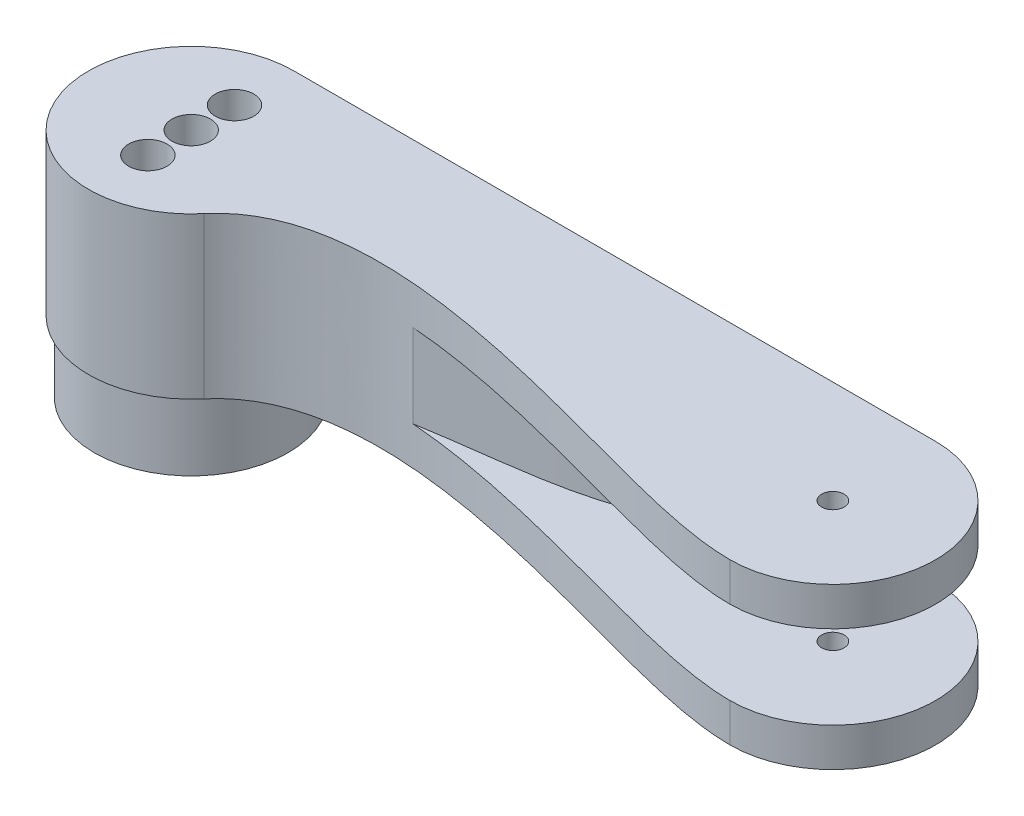
ISO-10303-21;
HEADER;
FILE_DESCRIPTION(('STEP AP214'),'2;1');
FILE_NAME('part.step','',(''),(''),'','','');
FILE_SCHEMA(('AUTOMOTIVE_DESIGN { 1 0 10303 214 1 1 1 1 }'));
ENDSEC;
DATA;
#1=APPLICATION_CONTEXT('core data for automotive mechanical design processes');
#2=APPLICATION_PROTOCOL_DEFINITION('international standard','automotive_design',2000,#1);
#3=PRODUCT_CONTEXT('',#1,'mechanical');
#4=PRODUCT('Part','Part','',(#3));
#5=PRODUCT_RELATED_PRODUCT_CATEGORY('part','',(#4));
#6=PRODUCT_DEFINITION_FORMATION('','',#4);
#7=PRODUCT_DEFINITION_CONTEXT('part definition',#1,'design');
#8=PRODUCT_DEFINITION('design','',#6,#7);
#9=PRODUCT_DEFINITION_SHAPE('','',#8);
#10=(LENGTH_UNIT() NAMED_UNIT(*) SI_UNIT(.MILLI.,.METRE.));
#11=(NAMED_UNIT(*) PLANE_ANGLE_UNIT() SI_UNIT($,.RADIAN.));
#12=(NAMED_UNIT(*) SI_UNIT($,.STERADIAN.) SOLID_ANGLE_UNIT());
#13=UNCERTAINTY_MEASURE_WITH_UNIT(LENGTH_MEASURE(1.E-05),#10,'distance_accuracy_value','');
#14=(GEOMETRIC_REPRESENTATION_CONTEXT(3) GLOBAL_UNCERTAINTY_ASSIGNED_CONTEXT((#13)) GLOBAL_UNIT_ASSIGNED_CONTEXT((#10,
#11,#12)) REPRESENTATION_CONTEXT('',''));
#15=CARTESIAN_POINT('',(0.,0.,0.));
#16=DIRECTION('',(0.,0.,1.));
#17=DIRECTION('',(1.,0.,0.));
#18=AXIS2_PLACEMENT_3D('',#15,#16,#17);
#19=CARTESIAN_POINT('',(-50.,6.,0.));
#20=DIRECTION('',(0.,1.,0.));
#21=DIRECTION('',(0.,0.,1.));
#22=AXIS2_PLACEMENT_3D('',#19,#20,#21);
#23=PLANE('',#22);
#24=CARTESIAN_POINT('',(50.,6.,0.));
#25=DIRECTION('',(0.,-1.,0.));
#26=DIRECTION('',(0.,0.,-1.));
#27=AXIS2_PLACEMENT_3D('',#24,#25,#26);
#28=CIRCLE('',#27,1.75);
#29=CARTESIAN_POINT('',(50.,6.,-1.75000000000002));
#30=VERTEX_POINT('',#29);
#31=EDGE_CURVE('E146',#30,#30,#28,.T.);
#32=ORIENTED_EDGE('',*,*,#31,.T.);
#33=EDGE_LOOP('',(#32));
#34=FACE_BOUND('',#33,.T.);
#35=CARTESIAN_POINT('',(-34.2856764118283,6.,16.));
#36=CARTESIAN_POINT('',(-23.6762783257379,6.,-6.11814593544332));
#37=CARTESIAN_POINT('',(21.9928600173767,6.,10.8621580125102));
#38=CARTESIAN_POINT('',(30.,6.,-16.));
#39=B_SPLINE_CURVE_WITH_KNOTS('',3,(#35,#36,#37,#38),.UNSPECIFIED.,.F.,.F.,(4,4),(0.,1.),.UNSPECIFIED.);
#40=CARTESIAN_POINT('',(-12.0743102711399,6.00000000000001,3.35363574440017));
#41=VERTEX_POINT('',#40);
#42=CARTESIAN_POINT('',(30.,6.,-16.));
#43=VERTEX_POINT('',#42);
#44=EDGE_CURVE('E88',#41,#43,#39,.T.);
#45=ORIENTED_EDGE('',*,*,#44,.F.);
#46=CARTESIAN_POINT('',(-37.7312638091283,6.,10.2702537592211));
#47=CARTESIAN_POINT('',(-30.3325567034885,6.,1.43183673850022));
#48=CARTESIAN_POINT('',(6.05040288848306,6.,3.36458797267431));
#49=CARTESIAN_POINT('',(38.5122315829498,6.,16.));
#50=CARTESIAN_POINT('',(50.,6.,16.));
#51=B_SPLINE_CURVE_WITH_KNOTS('',3,(#46,#47,#48,#49,#50),.UNSPECIFIED.,.F.,.F.,(4,1,4),(0.,
0.426660682996785,1.),.UNSPECIFIED.);
#52=CARTESIAN_POINT('',(50.,6.,16.));
#53=VERTEX_POINT('',#52);
#54=EDGE_CURVE('E240',#53,#41,#51,.F.);
#55=ORIENTED_EDGE('',*,*,#54,.F.);
#56=CARTESIAN_POINT('',(50.,6.,0.));
#57=DIRECTION('',(0.,1.,0.));
#58=DIRECTION('',(0.,0.,1.));
#59=AXIS2_PLACEMENT_3D('',#56,#57,#58);
#60=CIRCLE('',#59,16.);
#61=CARTESIAN_POINT('',(50.,6.,-16.));
#62=VERTEX_POINT('',#61);
#63=EDGE_CURVE('E68',#53,#62,#60,.T.);
#64=ORIENTED_EDGE('',*,*,#63,.T.);
#65=DIRECTION('',(-1.,0.,0.));
#66=VECTOR('',#65,1.);
#67=CARTESIAN_POINT('',(-50.,6.,-16.));
#68=LINE('',#67,#66);
#69=EDGE_CURVE('E153',#62,#43,#68,.T.);
#70=ORIENTED_EDGE('',*,*,#69,.T.);
#71=EDGE_LOOP('',(#45,#55,#64,#70));
#72=FACE_BOUND('',#71,.T.);
#73=ADVANCED_FACE('F43',(#34,#72),#23,.T.);
#74=CARTESIAN_POINT('',(-50.,0.,0.));
#75=DIRECTION('',(0.,1.,0.));
#76=DIRECTION('',(0.,0.,1.));
#77=AXIS2_PLACEMENT_3D('',#74,#75,#76);
#78=PLANE('',#77);
#79=CARTESIAN_POINT('',(-50.,0.,0.));
#80=DIRECTION('',(0.,1.,0.));
#81=DIRECTION('',(0.,0.,1.));
#82=AXIS2_PLACEMENT_3D('',#79,#80,#81);
#83=CIRCLE('',#82,15.1);
#84=CARTESIAN_POINT('',(-50.,0.,15.1));
#85=VERTEX_POINT('',#84);
#86=EDGE_CURVE('E11',#85,#85,#83,.F.);
#87=ORIENTED_EDGE('',*,*,#86,.F.);
#88=EDGE_LOOP('',(#87));
#89=FACE_BOUND('',#88,.T.);
#90=CARTESIAN_POINT('',(50.,0.,0.));
#91=DIRECTION('',(0.,-1.,0.));
#92=DIRECTION('',(0.,0.,-1.));
#93=AXIS2_PLACEMENT_3D('',#90,#91,#92);
#94=CIRCLE('',#93,1.75);
#95=CARTESIAN_POINT('',(50.,0.,-1.75000000000002));
#96=VERTEX_POINT('',#95);
#97=EDGE_CURVE('E469',#96,#96,#94,.T.);
#98=ORIENTED_EDGE('',*,*,#97,.F.);
#99=EDGE_LOOP('',(#98));
#100=FACE_BOUND('',#99,.T.);
#101=CARTESIAN_POINT('',(-37.7312638091283,0.,10.2702537592211));
#102=CARTESIAN_POINT('',(-30.3325567034885,0.,1.43183673850022));
#103=CARTESIAN_POINT('',(6.05040288848306,0.,3.36458797267431));
#104=CARTESIAN_POINT('',(38.5122315829498,0.,16.));
#105=CARTESIAN_POINT('',(50.,0.,16.));
#106=B_SPLINE_CURVE_WITH_KNOTS('',3,(#101,#102,#103,#104,#105),.UNSPECIFIED.,.F.,.F.,(4,1,4),
(0.,0.426660682996785,1.),.UNSPECIFIED.);
#107=CARTESIAN_POINT('',(50.,0.,16.));
#108=VERTEX_POINT('',#107);
#109=CARTESIAN_POINT('',(-37.7312638091283,0.,10.2702537592211));
#110=VERTEX_POINT('',#109);
#111=EDGE_CURVE('E128',#108,#110,#106,.F.);
#112=ORIENTED_EDGE('',*,*,#111,.T.);
#113=CARTESIAN_POINT('',(-50.,0.,0.));
#114=DIRECTION('',(0.,1.,0.));
#115=DIRECTION('',(0.,0.,1.));
#116=AXIS2_PLACEMENT_3D('',#113,#114,#115);
#117=CIRCLE('',#116,16.);
#118=CARTESIAN_POINT('',(-50.,0.,-16.));
#119=VERTEX_POINT('',#118);
#120=EDGE_CURVE('E143',#119,#110,#117,.T.);
#121=ORIENTED_EDGE('',*,*,#120,.F.);
#122=DIRECTION('',(-1.,0.,0.));
#123=VECTOR('',#122,1.);
#124=CARTESIAN_POINT('',(-50.,0.,-16.));
#125=LINE('',#124,#123);
#126=CARTESIAN_POINT('',(50.,0.,-16.));
#127=VERTEX_POINT('',#126);
#128=EDGE_CURVE('E142',#127,#119,#125,.T.);
#129=ORIENTED_EDGE('',*,*,#128,.F.);
#130=CARTESIAN_POINT('',(50.,0.,0.));
#131=DIRECTION('',(0.,1.,0.));
#132=DIRECTION('',(0.,0.,1.));
#133=AXIS2_PLACEMENT_3D('',#130,#131,#132);
#134=CIRCLE('',#133,16.);
#135=EDGE_CURVE('E80',#108,#127,#134,.T.);
#136=ORIENTED_EDGE('',*,*,#135,.F.);
#137=EDGE_LOOP('',(#112,#121,#129,#136));
#138=FACE_BOUND('',#137,.T.);
#139=ADVANCED_FACE('F141',(#89,#100,#138),#78,.F.);
#140=CARTESIAN_POINT('',(-34.2856764118283,19.,16.));
#141=CARTESIAN_POINT('',(-23.6762783257379,19.,-6.11814593544332));
#142=CARTESIAN_POINT('',(21.9928600173767,19.,10.8621580125102));
#143=CARTESIAN_POINT('',(30.,19.,-16.));
#144=B_SPLINE_CURVE_WITH_KNOTS('',3,(#140,#141,#142,#143),.UNSPECIFIED.,.F.,.F.,(4,4),(0.,1.),.UNSPECIFIED.);
#145=DIRECTION('',(0.,-1.,0.));
#146=VECTOR('',#145,1.);
#147=SURFACE_OF_LINEAR_EXTRUSION('',#144,#146);
#148=DIRECTION('',(0.,-1.,0.));
#149=VECTOR('',#148,1.);
#150=CARTESIAN_POINT('',(-12.0743102711399,19.,3.35363574440017));
#151=LINE('',#150,#149);
#152=CARTESIAN_POINT('',(-12.074310274312,19.,3.35363574415139));
#153=VERTEX_POINT('',#152);
#154=EDGE_CURVE('E246',#153,#41,#151,.T.);
#155=ORIENTED_EDGE('',*,*,#154,.T.);
#156=ORIENTED_EDGE('',*,*,#44,.T.);
#157=DIRECTION('',(0.,-1.,0.));
#158=VECTOR('',#157,1.);
#159=CARTESIAN_POINT('',(30.,19.,-16.));
#160=LINE('',#159,#158);
#161=CARTESIAN_POINT('',(30.,19.,-16.));
#162=VERTEX_POINT('',#161);
#163=EDGE_CURVE('E157',#162,#43,#160,.T.);
#164=ORIENTED_EDGE('',*,*,#163,.F.);
#165=EDGE_CURVE('E95',#153,#162,#144,.T.);
#166=ORIENTED_EDGE('',*,*,#165,.F.);
#167=EDGE_LOOP('',(#155,#156,#164,#166));
#168=FACE_BOUND('',#167,.T.);
#169=ADVANCED_FACE('F175',(#168),#147,.F.);
#170=CARTESIAN_POINT('',(-50.,19.,0.));
#171=DIRECTION('',(0.,1.,0.));
#172=DIRECTION('',(0.,0.,1.));
#173=AXIS2_PLACEMENT_3D('',#170,#171,#172);
#174=PLANE('',#173);
#175=CARTESIAN_POINT('',(50.,19.,0.));
#176=DIRECTION('',(0.,1.,0.));
#177=DIRECTION('',(0.,0.,1.));
#178=AXIS2_PLACEMENT_3D('',#175,#176,#177);
#179=CIRCLE('',#178,1.75);
#180=CARTESIAN_POINT('',(50.,19.,1.74999999999999));
#181=VERTEX_POINT('',#180);
#182=EDGE_CURVE('E222',#181,#181,#179,.F.);
#183=ORIENTED_EDGE('',*,*,#182,.F.);
#184=EDGE_LOOP('',(#183));
#185=FACE_BOUND('',#184,.T.);
#186=CARTESIAN_POINT('',(-37.7312638091283,19.,10.2702537592211));
#187=CARTESIAN_POINT('',(-30.3325567034885,19.,1.43183673850022));
#188=CARTESIAN_POINT('',(6.05040288848306,19.,3.36458797267431));
#189=CARTESIAN_POINT('',(38.5122315829498,19.,16.));
#190=CARTESIAN_POINT('',(50.,19.,16.));
#191=B_SPLINE_CURVE_WITH_KNOTS('',3,(#186,#187,#188,#189,#190),.UNSPECIFIED.,.F.,.F.,(4,1,4),
(0.,0.426660682996785,1.),.UNSPECIFIED.);
#192=CARTESIAN_POINT('',(50.,19.,16.));
#193=VERTEX_POINT('',#192);
#194=EDGE_CURVE('E134',#193,#153,#191,.F.);
#195=ORIENTED_EDGE('',*,*,#194,.T.);
#196=ORIENTED_EDGE('',*,*,#165,.T.);
#197=DIRECTION('',(-1.,0.,0.));
#198=VECTOR('',#197,1.);
#199=CARTESIAN_POINT('',(-50.,19.,-16.));
#200=LINE('',#199,#198);
#201=CARTESIAN_POINT('',(50.,19.,-16.));
#202=VERTEX_POINT('',#201);
#203=EDGE_CURVE('E218',#202,#162,#200,.T.);
#204=ORIENTED_EDGE('',*,*,#203,.F.);
#205=CARTESIAN_POINT('',(50.,19.,0.));
#206=DIRECTION('',(0.,1.,0.));
#207=DIRECTION('',(0.,0.,1.));
#208=AXIS2_PLACEMENT_3D('',#205,#206,#207);
#209=CIRCLE('',#208,16.);
#210=EDGE_CURVE('E220',#193,#202,#209,.T.);
#211=ORIENTED_EDGE('',*,*,#210,.F.);
#212=EDGE_LOOP('',(#195,#196,#204,#211));
#213=FACE_BOUND('',#212,.T.);
#214=ADVANCED_FACE('F179',(#185,#213),#174,.F.);
#215=CARTESIAN_POINT('',(-50.,25.,0.));
#216=DIRECTION('',(0.,1.,0.));
#217=DIRECTION('',(0.,0.,1.));
#218=AXIS2_PLACEMENT_3D('',#215,#216,#217);
#219=PLANE('',#218);
#220=CARTESIAN_POINT('',(-50.,25.,6.75));
#221=DIRECTION('',(0.,1.,0.));
#222=DIRECTION('',(0.,0.,1.));
#223=AXIS2_PLACEMENT_3D('',#220,#221,#222);
#224=CIRCLE('',#223,3.);
#225=CARTESIAN_POINT('',(-50.,25.,9.75));
#226=VERTEX_POINT('',#225);
#227=EDGE_CURVE('E438',#226,#226,#224,.F.);
#228=ORIENTED_EDGE('',*,*,#227,.T.);
#229=EDGE_LOOP('',(#228));
#230=FACE_BOUND('',#229,.T.);
#231=CARTESIAN_POINT('',(-49.9999999999995,25.,-6.75));
#232=DIRECTION('',(0.,1.,0.));
#233=DIRECTION('',(0.,0.,1.));
#234=AXIS2_PLACEMENT_3D('',#231,#232,#233);
#235=CIRCLE('',#234,3.);
#236=CARTESIAN_POINT('',(-49.9999999999995,25.,-3.75));
#237=VERTEX_POINT('',#236);
#238=EDGE_CURVE('E443',#237,#237,#235,.F.);
#239=ORIENTED_EDGE('',*,*,#238,.T.);
#240=EDGE_LOOP('',(#239));
#241=FACE_BOUND('',#240,.T.);
#242=CARTESIAN_POINT('',(-50.,25.,0.));
#243=DIRECTION('',(0.,1.,0.));
#244=DIRECTION('',(0.,0.,1.));
#245=AXIS2_PLACEMENT_3D('',#242,#243,#244);
#246=CIRCLE('',#245,3.);
#247=CARTESIAN_POINT('',(-50.,25.,3.));
#248=VERTEX_POINT('',#247);
#249=EDGE_CURVE('E451',#248,#248,#246,.F.);
#250=ORIENTED_EDGE('',*,*,#249,.T.);
#251=EDGE_LOOP('',(#250));
#252=FACE_BOUND('',#251,.T.);
#253=CARTESIAN_POINT('',(50.,25.,0.));
#254=DIRECTION('',(0.,1.,0.));
#255=DIRECTION('',(0.,0.,1.));
#256=AXIS2_PLACEMENT_3D('',#253,#254,#255);
#257=CIRCLE('',#256,1.75);
#258=CARTESIAN_POINT('',(50.,25.,1.74999999999999));
#259=VERTEX_POINT('',#258);
#260=EDGE_CURVE('E228',#259,#259,#257,.T.);
#261=ORIENTED_EDGE('',*,*,#260,.F.);
#262=EDGE_LOOP('',(#261));
#263=FACE_BOUND('',#262,.T.);
#264=CARTESIAN_POINT('',(-50.,25.,0.));
#265=DIRECTION('',(0.,1.,0.));
#266=DIRECTION('',(0.,0.,1.));
#267=AXIS2_PLACEMENT_3D('',#264,#265,#266);
#268=CIRCLE('',#267,16.);
#269=CARTESIAN_POINT('',(-50.,25.,-16.));
#270=VERTEX_POINT('',#269);
#271=CARTESIAN_POINT('',(-37.7312638091283,25.,10.2702537592211));
#272=VERTEX_POINT('',#271);
#273=EDGE_CURVE('E59',#270,#272,#268,.T.);
#274=ORIENTED_EDGE('',*,*,#273,.T.);
#275=CARTESIAN_POINT('',(-37.7312638091283,25.,10.2702537592211));
#276=CARTESIAN_POINT('',(-30.3325567034885,25.,1.43183673850022));
#277=CARTESIAN_POINT('',(6.05040288848306,25.,3.36458797267431));
#278=CARTESIAN_POINT('',(38.5122315829498,25.,16.));
#279=CARTESIAN_POINT('',(50.,25.,16.));
#280=B_SPLINE_CURVE_WITH_KNOTS('',3,(#275,#276,#277,#278,#279),.UNSPECIFIED.,.F.,.F.,(4,1,4),
(0.,0.426660682996785,1.),.UNSPECIFIED.);
#281=CARTESIAN_POINT('',(50.,25.,16.));
#282=VERTEX_POINT('',#281);
#283=EDGE_CURVE('E245',#272,#282,#280,.T.);
#284=ORIENTED_EDGE('',*,*,#283,.T.);
#285=CARTESIAN_POINT('',(50.,25.,0.));
#286=DIRECTION('',(0.,1.,0.));
#287=DIRECTION('',(0.,0.,1.));
#288=AXIS2_PLACEMENT_3D('',#285,#286,#287);
#289=CIRCLE('',#288,16.);
#290=CARTESIAN_POINT('',(50.,25.,-16.));
#291=VERTEX_POINT('',#290);
#292=EDGE_CURVE('E212',#282,#291,#289,.T.);
#293=ORIENTED_EDGE('',*,*,#292,.T.);
#294=DIRECTION('',(-1.,0.,0.));
#295=VECTOR('',#294,1.);
#296=CARTESIAN_POINT('',(-50.,25.,-16.));
#297=LINE('',#296,#295);
#298=EDGE_CURVE('E210',#291,#270,#297,.T.);
#299=ORIENTED_EDGE('',*,*,#298,.T.);
#300=EDGE_LOOP('',(#274,#284,#293,#299));
#301=FACE_BOUND('',#300,.T.);
#302=ADVANCED_FACE('F200',(#230,#241,#252,#263,#301),#219,.T.);
#303=CARTESIAN_POINT('',(-50.,6.,0.));
#304=DIRECTION('',(0.,-1.,0.));
#305=DIRECTION('',(0.,0.,-1.));
#306=AXIS2_PLACEMENT_3D('',#303,#304,#305);
#307=CYLINDRICAL_SURFACE('',#306,16.);
#308=ORIENTED_EDGE('',*,*,#120,.T.);
#309=DIRECTION('',(0.,1.,0.));
#310=VECTOR('',#309,1.);
#311=CARTESIAN_POINT('',(-37.7312638091283,-0.001000000000001,10.2702537592211));
#312=LINE('',#311,#310);
#313=EDGE_CURVE('E131',#110,#272,#312,.T.);
#314=ORIENTED_EDGE('',*,*,#313,.T.);
#315=ORIENTED_EDGE('',*,*,#273,.F.);
#316=DIRECTION('',(0.,-1.,0.));
#317=VECTOR('',#316,1.);
#318=CARTESIAN_POINT('',(-50.,6.,-16.));
#319=LINE('',#318,#317);
#320=EDGE_CURVE('E150',#270,#119,#319,.T.);
#321=ORIENTED_EDGE('',*,*,#320,.T.);
#322=EDGE_LOOP('',(#308,#314,#315,#321));
#323=FACE_BOUND('',#322,.T.);
#324=ADVANCED_FACE('F45',(#323),#307,.T.);
#325=CARTESIAN_POINT('',(50.,6.,0.));
#326=DIRECTION('',(0.,-1.,0.));
#327=DIRECTION('',(0.,0.,-1.));
#328=AXIS2_PLACEMENT_3D('',#325,#326,#327);
#329=CYLINDRICAL_SURFACE('',#328,16.);
#330=ORIENTED_EDGE('',*,*,#135,.T.);
#331=DIRECTION('',(0.,-1.,0.));
#332=VECTOR('',#331,1.);
#333=CARTESIAN_POINT('',(50.,6.,-16.));
#334=LINE('',#333,#332);
#335=EDGE_CURVE('E138',#62,#127,#334,.T.);
#336=ORIENTED_EDGE('',*,*,#335,.F.);
#337=ORIENTED_EDGE('',*,*,#63,.F.);
#338=DIRECTION('',(0.,-1.,0.));
#339=VECTOR('',#338,1.);
#340=CARTESIAN_POINT('',(50.,6.,16.));
#341=LINE('',#340,#339);
#342=EDGE_CURVE('E52',#53,#108,#341,.T.);
#343=ORIENTED_EDGE('',*,*,#342,.T.);
#344=EDGE_LOOP('',(#330,#336,#337,#343));
#345=FACE_BOUND('',#344,.T.);
#346=ADVANCED_FACE('F137',(#345),#329,.T.);
#347=CARTESIAN_POINT('',(-50.,6.,-16.));
#348=DIRECTION('',(0.,0.,1.));
#349=DIRECTION('',(1.,0.,0.));
#350=AXIS2_PLACEMENT_3D('',#347,#348,#349);
#351=PLANE('',#350);
#352=ORIENTED_EDGE('',*,*,#128,.T.);
#353=ORIENTED_EDGE('',*,*,#320,.F.);
#354=ORIENTED_EDGE('',*,*,#298,.F.);
#355=DIRECTION('',(0.,-1.,0.));
#356=VECTOR('',#355,1.);
#357=CARTESIAN_POINT('',(50.,25.,-16.));
#358=LINE('',#357,#356);
#359=EDGE_CURVE('E164',#291,#202,#358,.T.);
#360=ORIENTED_EDGE('',*,*,#359,.T.);
#361=ORIENTED_EDGE('',*,*,#203,.T.);
#362=ORIENTED_EDGE('',*,*,#163,.T.);
#363=ORIENTED_EDGE('',*,*,#69,.F.);
#364=ORIENTED_EDGE('',*,*,#335,.T.);
#365=EDGE_LOOP('',(#352,#353,#354,#360,#361,#362,#363,#364));
#366=FACE_BOUND('',#365,.T.);
#367=ADVANCED_FACE('F185',(#366),#351,.F.);
#368=CARTESIAN_POINT('',(50.,6.,0.));
#369=DIRECTION('',(0.,-1.,0.));
#370=DIRECTION('',(0.,0.,-1.));
#371=AXIS2_PLACEMENT_3D('',#368,#369,#370);
#372=CYLINDRICAL_SURFACE('',#371,1.75);
#373=ORIENTED_EDGE('',*,*,#31,.F.);
#374=EDGE_LOOP('',(#373));
#375=FACE_BOUND('',#374,.T.);
#376=ORIENTED_EDGE('',*,*,#97,.T.);
#377=EDGE_LOOP('',(#376));
#378=FACE_BOUND('',#377,.T.);
#379=ADVANCED_FACE('F182',(#375,#378),#372,.F.);
#380=CARTESIAN_POINT('',(50.,25.,0.));
#381=DIRECTION('',(0.,-1.,0.));
#382=DIRECTION('',(0.,0.,-1.));
#383=AXIS2_PLACEMENT_3D('',#380,#381,#382);
#384=CYLINDRICAL_SURFACE('',#383,16.);
#385=ORIENTED_EDGE('',*,*,#210,.T.);
#386=ORIENTED_EDGE('',*,*,#359,.F.);
#387=ORIENTED_EDGE('',*,*,#292,.F.);
#388=DIRECTION('',(0.,-1.,0.));
#389=VECTOR('',#388,1.);
#390=CARTESIAN_POINT('',(50.,25.,16.));
#391=LINE('',#390,#389);
#392=EDGE_CURVE('E215',#282,#193,#391,.T.);
#393=ORIENTED_EDGE('',*,*,#392,.T.);
#394=EDGE_LOOP('',(#385,#386,#387,#393));
#395=FACE_BOUND('',#394,.T.);
#396=ADVANCED_FACE('F180',(#395),#384,.T.);
#397=CARTESIAN_POINT('',(50.,-0.001000000000001,0.));
#398=DIRECTION('',(0.,1.,0.));
#399=DIRECTION('',(0.,0.,1.));
#400=AXIS2_PLACEMENT_3D('',#397,#398,#399);
#401=CYLINDRICAL_SURFACE('',#400,1.75);
#402=ORIENTED_EDGE('',*,*,#260,.T.);
#403=EDGE_LOOP('',(#402));
#404=FACE_BOUND('',#403,.T.);
#405=ORIENTED_EDGE('',*,*,#182,.T.);
#406=EDGE_LOOP('',(#405));
#407=FACE_BOUND('',#406,.T.);
#408=ADVANCED_FACE('F276',(#404,#407),#401,.F.);
#409=CARTESIAN_POINT('',(-37.7312638091283,-0.000999999999997531,10.2702537592211));
#410=CARTESIAN_POINT('',(-30.3325567034885,-0.000999999999997531,1.43183673850022));
#411=CARTESIAN_POINT('',(6.05040288848306,-0.000999999999997531,3.36458797267431));
#412=CARTESIAN_POINT('',(38.5122315829498,-0.000999999999997531,16.));
#413=CARTESIAN_POINT('',(50.,-0.000999999999997531,16.));
#414=B_SPLINE_CURVE_WITH_KNOTS('',3,(#409,#410,#411,#412,#413),.UNSPECIFIED.,.F.,.F.,(4,1,4),
(0.,0.426660682996785,1.),.UNSPECIFIED.);
#415=DIRECTION('',(0.,1.,0.));
#416=VECTOR('',#415,1.);
#417=SURFACE_OF_LINEAR_EXTRUSION('',#414,#416);
#418=ORIENTED_EDGE('',*,*,#342,.F.);
#419=ORIENTED_EDGE('',*,*,#54,.T.);
#420=ORIENTED_EDGE('',*,*,#154,.F.);
#421=ORIENTED_EDGE('',*,*,#194,.F.);
#422=ORIENTED_EDGE('',*,*,#392,.F.);
#423=ORIENTED_EDGE('',*,*,#283,.F.);
#424=ORIENTED_EDGE('',*,*,#313,.F.);
#425=ORIENTED_EDGE('',*,*,#111,.F.);
#426=EDGE_LOOP('',(#418,#419,#420,#421,#422,#423,#424,#425));
#427=FACE_BOUND('',#426,.T.);
#428=ADVANCED_FACE('F129',(#427),#417,.T.);
#429=CARTESIAN_POINT('',(-50.,-11.,0.));
#430=DIRECTION('',(0.,1.,0.));
#431=DIRECTION('',(0.,0.,1.));
#432=AXIS2_PLACEMENT_3D('',#429,#430,#431);
#433=CYLINDRICAL_SURFACE('',#432,15.1);
#434=CARTESIAN_POINT('',(-50.,-11.,0.));
#435=DIRECTION('',(0.,-1.,0.));
#436=DIRECTION('',(0.,0.,-1.));
#437=AXIS2_PLACEMENT_3D('',#434,#435,#436);
#438=CIRCLE('',#437,15.1);
#439=CARTESIAN_POINT('',(-50.,-11.,-15.1));
#440=VERTEX_POINT('',#439);
#441=EDGE_CURVE('E135',#440,#440,#438,.T.);
#442=ORIENTED_EDGE('',*,*,#441,.F.);
#443=EDGE_LOOP('',(#442));
#444=FACE_BOUND('',#443,.T.);
#445=ORIENTED_EDGE('',*,*,#86,.T.);
#446=EDGE_LOOP('',(#445));
#447=FACE_BOUND('',#446,.T.);
#448=ADVANCED_FACE('F275',(#444,#447),#433,.T.);
#449=CARTESIAN_POINT('',(-50.,-11.,0.));
#450=DIRECTION('',(0.,-1.,0.));
#451=DIRECTION('',(0.,0.,-1.));
#452=AXIS2_PLACEMENT_3D('',#449,#450,#451);
#453=PLANE('',#452);
#454=CARTESIAN_POINT('',(-50.,-11.,0.));
#455=DIRECTION('',(0.,-1.,0.));
#456=DIRECTION('',(0.,0.,-1.));
#457=AXIS2_PLACEMENT_3D('',#454,#455,#456);
#458=CIRCLE('',#457,3.);
#459=CARTESIAN_POINT('',(-50.,-11.,3.));
#460=VERTEX_POINT('',#459);
#461=EDGE_CURVE('E47',#460,#460,#458,.F.);
#462=ORIENTED_EDGE('',*,*,#461,.T.);
#463=EDGE_LOOP('',(#462));
#464=FACE_BOUND('',#463,.T.);
#465=CARTESIAN_POINT('',(-50.,-11.,6.75));
#466=DIRECTION('',(0.,-1.,0.));
#467=DIRECTION('',(0.,0.,-1.));
#468=AXIS2_PLACEMENT_3D('',#465,#466,#467);
#469=CIRCLE('',#468,1.75);
#470=CARTESIAN_POINT('',(-50.,-11.,5.));
#471=VERTEX_POINT('',#470);
#472=EDGE_CURVE('E454',#471,#471,#469,.T.);
#473=ORIENTED_EDGE('',*,*,#472,.F.);
#474=EDGE_LOOP('',(#473));
#475=FACE_BOUND('',#474,.T.);
#476=CARTESIAN_POINT('',(-50.,-11.,-6.75));
#477=DIRECTION('',(0.,-1.,0.));
#478=DIRECTION('',(0.,0.,-1.));
#479=AXIS2_PLACEMENT_3D('',#476,#477,#478);
#480=CIRCLE('',#479,1.75);
#481=CARTESIAN_POINT('',(-50.,-11.,-8.5));
#482=VERTEX_POINT('',#481);
#483=EDGE_CURVE('E457',#482,#482,#480,.T.);
#484=ORIENTED_EDGE('',*,*,#483,.F.);
#485=EDGE_LOOP('',(#484));
#486=FACE_BOUND('',#485,.T.);
#487=ORIENTED_EDGE('',*,*,#441,.T.);
#488=EDGE_LOOP('',(#487));
#489=FACE_BOUND('',#488,.T.);
#490=ADVANCED_FACE('F349',(#464,#475,#486,#489),#453,.T.);
#491=CARTESIAN_POINT('',(-50.,-0.999999999999999,-6.75));
#492=DIRECTION('',(0.,-1.,0.));
#493=DIRECTION('',(0.,0.,-1.));
#494=AXIS2_PLACEMENT_3D('',#491,#492,#493);
#495=CYLINDRICAL_SURFACE('',#494,1.75);
#496=CARTESIAN_POINT('',(-50.,-0.999999999999999,-6.75));
#497=DIRECTION('',(0.,-1.,0.));
#498=DIRECTION('',(0.,0.,-1.));
#499=AXIS2_PLACEMENT_3D('',#496,#497,#498);
#500=CIRCLE('',#499,1.75);
#501=CARTESIAN_POINT('',(-50.,-0.999999999999999,-8.5));
#502=VERTEX_POINT('',#501);
#503=EDGE_CURVE('E440',#502,#502,#500,.T.);
#504=ORIENTED_EDGE('',*,*,#503,.F.);
#505=EDGE_LOOP('',(#504));
#506=FACE_BOUND('',#505,.T.);
#507=ORIENTED_EDGE('',*,*,#483,.T.);
#508=EDGE_LOOP('',(#507));
#509=FACE_BOUND('',#508,.T.);
#510=ADVANCED_FACE('F359',(#506,#509),#495,.F.);
#511=CARTESIAN_POINT('',(-50.,-0.999999999999999,6.75));
#512=DIRECTION('',(0.,-1.,0.));
#513=DIRECTION('',(0.,0.,-1.));
#514=AXIS2_PLACEMENT_3D('',#511,#512,#513);
#515=CYLINDRICAL_SURFACE('',#514,1.75);
#516=CARTESIAN_POINT('',(-50.,-0.999999999999999,6.75));
#517=DIRECTION('',(0.,-1.,0.));
#518=DIRECTION('',(0.,0.,-1.));
#519=AXIS2_PLACEMENT_3D('',#516,#517,#518);
#520=CIRCLE('',#519,1.75);
#521=CARTESIAN_POINT('',(-50.,-0.999999999999999,5.));
#522=VERTEX_POINT('',#521);
#523=EDGE_CURVE('E433',#522,#522,#520,.T.);
#524=ORIENTED_EDGE('',*,*,#523,.F.);
#525=EDGE_LOOP('',(#524));
#526=FACE_BOUND('',#525,.T.);
#527=ORIENTED_EDGE('',*,*,#472,.T.);
#528=EDGE_LOOP('',(#527));
#529=FACE_BOUND('',#528,.T.);
#530=ADVANCED_FACE('F369',(#526,#529),#515,.F.);
#531=CARTESIAN_POINT('',(-50.,-11.000012,0.));
#532=DIRECTION('',(0.,1.,0.));
#533=DIRECTION('',(0.,0.,1.));
#534=AXIS2_PLACEMENT_3D('',#531,#532,#533);
#535=CYLINDRICAL_SURFACE('',#534,3.);
#536=CARTESIAN_POINT('',(-50.,-11.,3.));
#537=CARTESIAN_POINT('',(-50.,-10.625,3.));
#538=CARTESIAN_POINT('',(-50.,-10.25,3.));
#539=CARTESIAN_POINT('',(-50.,-9.5,3.));
#540=CARTESIAN_POINT('',(-50.,-9.125,3.));
#541=CARTESIAN_POINT('',(-50.,-8.375,3.));
#542=CARTESIAN_POINT('',(-50.,-8.,3.));
#543=CARTESIAN_POINT('',(-50.,-7.25,3.));
#544=CARTESIAN_POINT('',(-50.,-6.875,3.));
#545=CARTESIAN_POINT('',(-50.,-6.125,3.));
#546=CARTESIAN_POINT('',(-50.,-5.75,3.));
#547=CARTESIAN_POINT('',(-50.,-5.,3.));
#548=CARTESIAN_POINT('',(-50.,-4.625,3.));
#549=CARTESIAN_POINT('',(-50.,-3.875,3.));
#550=CARTESIAN_POINT('',(-50.,-3.5,3.));
#551=CARTESIAN_POINT('',(-50.,-2.75,3.));
#552=CARTESIAN_POINT('',(-50.,-2.375,3.));
#553=CARTESIAN_POINT('',(-50.,-1.625,3.));
#554=CARTESIAN_POINT('',(-50.,-1.25,3.));
#555=CARTESIAN_POINT('',(-50.,-0.499999999999996,3.));
#556=CARTESIAN_POINT('',(-50.,-0.124999999999996,3.));
#557=CARTESIAN_POINT('',(-50.,0.625000000000004,3.));
#558=CARTESIAN_POINT('',(-50.,1.,3.));
#559=CARTESIAN_POINT('',(-50.,1.75000000000001,3.));
#560=CARTESIAN_POINT('',(-50.,2.12500000000001,3.));
#561=CARTESIAN_POINT('',(-50.,2.87500000000001,3.));
#562=CARTESIAN_POINT('',(-50.,3.25,3.));
#563=CARTESIAN_POINT('',(-50.,4.,3.));
#564=CARTESIAN_POINT('',(-50.,4.375,3.));
#565=CARTESIAN_POINT('',(-50.,5.125,3.));
#566=CARTESIAN_POINT('',(-50.,5.5,3.));
#567=CARTESIAN_POINT('',(-50.,6.25,3.));
#568=CARTESIAN_POINT('',(-50.,6.625,3.));
#569=CARTESIAN_POINT('',(-50.,7.375,3.));
#570=CARTESIAN_POINT('',(-50.,7.75,3.));
#571=CARTESIAN_POINT('',(-50.,8.5,3.));
#572=CARTESIAN_POINT('',(-50.,8.875,3.));
#573=CARTESIAN_POINT('',(-50.,9.625,3.));
#574=CARTESIAN_POINT('',(-50.,10.,3.));
#575=CARTESIAN_POINT('',(-50.,10.75,3.));
#576=CARTESIAN_POINT('',(-50.,11.125,3.));
#577=CARTESIAN_POINT('',(-50.,11.875,3.));
#578=CARTESIAN_POINT('',(-50.,12.25,3.));
#579=CARTESIAN_POINT('',(-50.,13.,3.));
#580=CARTESIAN_POINT('',(-50.,13.375,3.));
#581=CARTESIAN_POINT('',(-50.,14.125,3.));
#582=CARTESIAN_POINT('',(-50.,14.5,3.));
#583=CARTESIAN_POINT('',(-50.,15.25,3.));
#584=CARTESIAN_POINT('',(-50.,15.625,3.));
#585=CARTESIAN_POINT('',(-50.,16.375,3.));
#586=CARTESIAN_POINT('',(-50.,16.75,3.));
#587=CARTESIAN_POINT('',(-50.,17.5,3.));
#588=CARTESIAN_POINT('',(-50.,17.875,3.));
#589=CARTESIAN_POINT('',(-50.,18.625,3.));
#590=CARTESIAN_POINT('',(-50.,19.,3.));
#591=CARTESIAN_POINT('',(-50.,19.75,3.));
#592=CARTESIAN_POINT('',(-50.,20.125,3.));
#593=CARTESIAN_POINT('',(-50.,20.875,3.));
#594=CARTESIAN_POINT('',(-50.,21.25,3.));
#595=CARTESIAN_POINT('',(-50.,22.,3.));
#596=CARTESIAN_POINT('',(-50.,22.375,3.));
#597=CARTESIAN_POINT('',(-50.,23.125,3.));
#598=CARTESIAN_POINT('',(-50.,23.5,3.));
#599=CARTESIAN_POINT('',(-50.,24.25,3.));
#600=CARTESIAN_POINT('',(-50.,24.625,3.));
#601=CARTESIAN_POINT('',(-50.,25.,3.));
#602=B_SPLINE_CURVE_WITH_KNOTS('',3,(#536,#537,#538,#539,#540,#541,#542,#543,#544,#545,#546,
#547,#548,#549,#550,#551,#552,#553,#554,#555,#556,#557,#558,#559,#560,#561,#562,#563,#564,#565,
#566,#567,#568,#569,#570,#571,#572,#573,#574,#575,#576,#577,#578,#579,#580,#581,#582,#583,#584,
#585,#586,#587,#588,#589,#590,#591,#592,#593,#594,#595,#596,#597,#598,#599,#600,#601),
.UNSPECIFIED.,.F.,.F.,(4,2,2,2,2,2,2,2,2,2,2,2,2,2,2,2,2,2,2,2,2,2,2,2,2,2,2,2,2,2,2,2,4),(0.,
1.125,2.25,3.375,4.5,5.625,6.75,7.875,9.,10.125,11.25,12.375,13.5,14.625,15.75,16.875,18.,
19.125,20.25,21.375,22.5,23.625,24.75,25.875,27.,28.125,29.25,30.375,31.5,32.625,33.75,34.875,
36.),.UNSPECIFIED.);
#603=EDGE_CURVE('BSEAM378',#460,#248,#602,.T.);
#604=ORIENTED_EDGE('',*,*,#461,.F.);
#605=ORIENTED_EDGE('',*,*,#249,.F.);
#606=ORIENTED_EDGE('',*,*,#603,.T.);
#607=ORIENTED_EDGE('',*,*,#603,.F.);
#608=EDGE_LOOP('',(#604,#606,#605,#607));
#609=FACE_BOUND('',#608,.T.);
#610=ADVANCED_FACE('F378',(#609),#535,.F.);
#611=CARTESIAN_POINT('',(-49.9999999999995,25.001025,-6.75));
#612=DIRECTION('',(0.,-1.,0.));
#613=DIRECTION('',(0.,0.,-1.));
#614=AXIS2_PLACEMENT_3D('',#611,#612,#613);
#615=CYLINDRICAL_SURFACE('',#614,3.);
#616=ORIENTED_EDGE('',*,*,#238,.F.);
#617=EDGE_LOOP('',(#616));
#618=FACE_BOUND('',#617,.T.);
#619=CARTESIAN_POINT('',(-49.9999999999995,-0.999999999999999,-6.75));
#620=DIRECTION('',(0.,-1.,0.));
#621=DIRECTION('',(0.,0.,-1.));
#622=AXIS2_PLACEMENT_3D('',#619,#620,#621);
#623=CIRCLE('',#622,3.);
#624=CARTESIAN_POINT('',(-49.9999999999995,-0.999999999999999,-9.75));
#625=VERTEX_POINT('',#624);
#626=EDGE_CURVE('E448',#625,#625,#623,.T.);
#627=ORIENTED_EDGE('',*,*,#626,.T.);
#628=EDGE_LOOP('',(#627));
#629=FACE_BOUND('',#628,.T.);
#630=ADVANCED_FACE('F387',(#618,#629),#615,.F.);
#631=CARTESIAN_POINT('',(-49.9999999999995,-0.999999999999999,-6.75));
#632=DIRECTION('',(0.,-1.,0.));
#633=DIRECTION('',(0.,0.,-1.));
#634=AXIS2_PLACEMENT_3D('',#631,#632,#633);
#635=PLANE('',#634);
#636=ORIENTED_EDGE('',*,*,#503,.T.);
#637=EDGE_LOOP('',(#636));
#638=FACE_BOUND('',#637,.T.);
#639=ORIENTED_EDGE('',*,*,#626,.F.);
#640=EDGE_LOOP('',(#639));
#641=FACE_BOUND('',#640,.T.);
#642=ADVANCED_FACE('F397',(#638,#641),#635,.F.);
#643=CARTESIAN_POINT('',(-50.,25.001025,6.75));
#644=DIRECTION('',(0.,-1.,0.));
#645=DIRECTION('',(0.,0.,-1.));
#646=AXIS2_PLACEMENT_3D('',#643,#644,#645);
#647=CYLINDRICAL_SURFACE('',#646,3.);
#648=ORIENTED_EDGE('',*,*,#227,.F.);
#649=EDGE_LOOP('',(#648));
#650=FACE_BOUND('',#649,.T.);
#651=CARTESIAN_POINT('',(-50.,-0.999999999999999,6.75));
#652=DIRECTION('',(0.,-1.,0.));
#653=DIRECTION('',(0.,0.,-1.));
#654=AXIS2_PLACEMENT_3D('',#651,#652,#653);
#655=CIRCLE('',#654,3.);
#656=CARTESIAN_POINT('',(-50.,-0.999999999999999,3.75));
#657=VERTEX_POINT('',#656);
#658=EDGE_CURVE('E436',#657,#657,#655,.T.);
#659=ORIENTED_EDGE('',*,*,#658,.T.);
#660=EDGE_LOOP('',(#659));
#661=FACE_BOUND('',#660,.T.);
#662=ADVANCED_FACE('F407',(#650,#661),#647,.F.);
#663=CARTESIAN_POINT('',(-50.,-0.999999999999999,6.75));
#664=DIRECTION('',(0.,-1.,0.));
#665=DIRECTION('',(0.,0.,-1.));
#666=AXIS2_PLACEMENT_3D('',#663,#664,#665);
#667=PLANE('',#666);
#668=ORIENTED_EDGE('',*,*,#523,.T.);
#669=EDGE_LOOP('',(#668));
#670=FACE_BOUND('',#669,.T.);
#671=ORIENTED_EDGE('',*,*,#658,.F.);
#672=EDGE_LOOP('',(#671));
#673=FACE_BOUND('',#672,.T.);
#674=ADVANCED_FACE('F417',(#670,#673),#667,.F.);
#675=CLOSED_SHELL('',(#73,#139,#169,#214,#302,#324,#346,#367,#379,#396,#408,#428,#448,#490,#510,
#530,#610,#630,#642,#662,#674));
#676=MANIFOLD_SOLID_BREP('B2',#675);
#677=ADVANCED_BREP_SHAPE_REPRESENTATION('',(#18,#676),#14);
#678=SHAPE_DEFINITION_REPRESENTATION(#9,#677);
ENDSEC;
END-ISO-10303-21;
